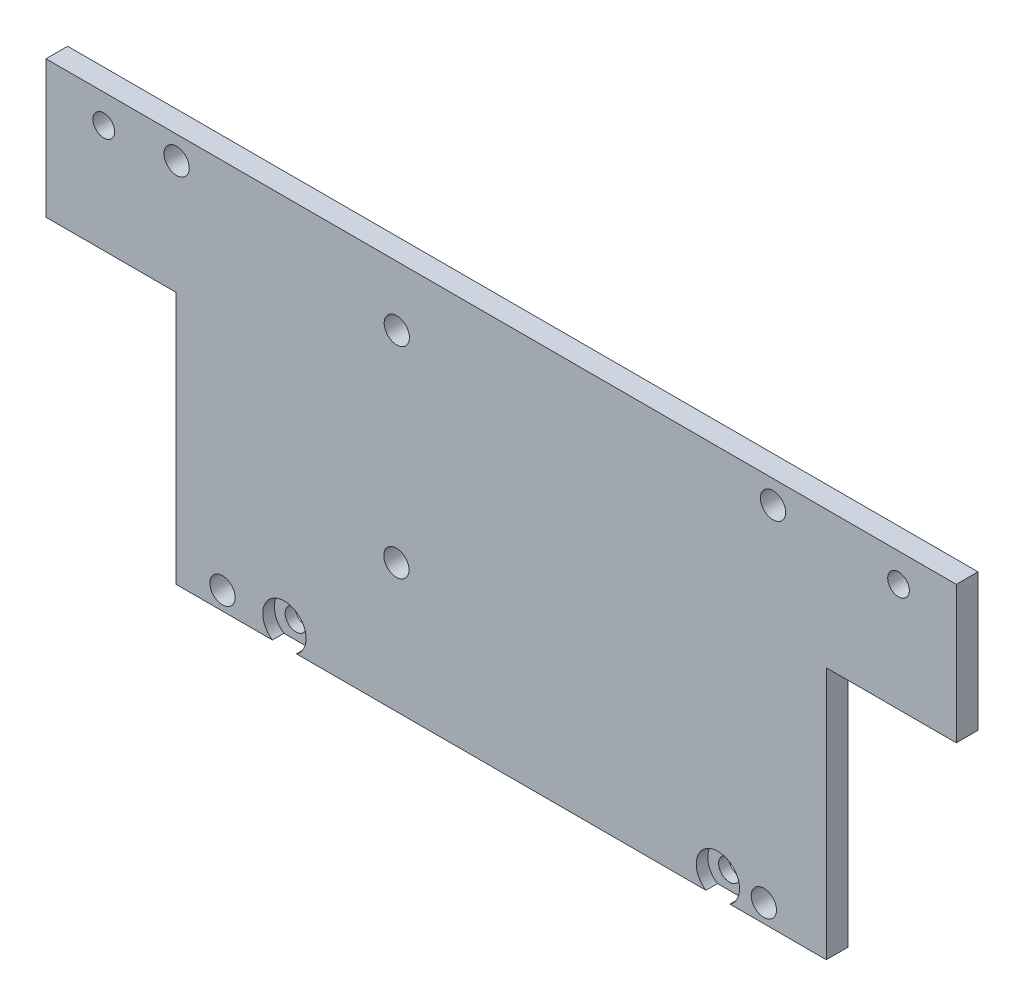
ISO-10303-21;
HEADER;
FILE_DESCRIPTION(('STEP AP214'),'2;1');
FILE_NAME('part.step','',(''),(''),'','','');
FILE_SCHEMA(('AUTOMOTIVE_DESIGN { 1 0 10303 214 1 1 1 1 }'));
ENDSEC;
DATA;
#1=APPLICATION_CONTEXT('core data for automotive mechanical design processes');
#2=APPLICATION_PROTOCOL_DEFINITION('international standard','automotive_design',2000,#1);
#3=PRODUCT_CONTEXT('',#1,'mechanical');
#4=PRODUCT('Part','Part','',(#3));
#5=PRODUCT_RELATED_PRODUCT_CATEGORY('part','',(#4));
#6=PRODUCT_DEFINITION_FORMATION('','',#4);
#7=PRODUCT_DEFINITION_CONTEXT('part definition',#1,'design');
#8=PRODUCT_DEFINITION('design','',#6,#7);
#9=PRODUCT_DEFINITION_SHAPE('','',#8);
#10=(LENGTH_UNIT() NAMED_UNIT(*) SI_UNIT(.MILLI.,.METRE.));
#11=(NAMED_UNIT(*) PLANE_ANGLE_UNIT() SI_UNIT($,.RADIAN.));
#12=(NAMED_UNIT(*) SI_UNIT($,.STERADIAN.) SOLID_ANGLE_UNIT());
#13=UNCERTAINTY_MEASURE_WITH_UNIT(LENGTH_MEASURE(1.E-05),#10,'distance_accuracy_value','');
#14=(GEOMETRIC_REPRESENTATION_CONTEXT(3) GLOBAL_UNCERTAINTY_ASSIGNED_CONTEXT((#13)) GLOBAL_UNIT_ASSIGNED_CONTEXT((#10,
#11,#12)) REPRESENTATION_CONTEXT('',''));
#15=CARTESIAN_POINT('',(0.,0.,0.));
#16=DIRECTION('',(0.,0.,1.));
#17=DIRECTION('',(1.,0.,0.));
#18=AXIS2_PLACEMENT_3D('',#15,#16,#17);
#19=CARTESIAN_POINT('',(45.,2.49999999999999,3.));
#20=DIRECTION('',(0.,0.,-1.));
#21=DIRECTION('',(-1.,0.,0.));
#22=AXIS2_PLACEMENT_3D('',#19,#20,#21);
#23=CYLINDRICAL_SURFACE('',#22,1.5);
#24=CARTESIAN_POINT('',(45.,2.49999999999999,0.));
#25=DIRECTION('',(0.,0.,-1.));
#26=DIRECTION('',(1.,0.,0.));
#27=AXIS2_PLACEMENT_3D('',#24,#25,#26);
#28=CIRCLE('',#27,1.5);
#29=CARTESIAN_POINT('',(46.5,2.49999999999999,0.));
#30=VERTEX_POINT('',#29);
#31=EDGE_CURVE('E217',#30,#30,#28,.T.);
#32=ORIENTED_EDGE('',*,*,#31,.T.);
#33=EDGE_LOOP('',(#32));
#34=FACE_BOUND('',#33,.T.);
#35=CARTESIAN_POINT('',(45.,2.49999999999999,1.4));
#36=DIRECTION('',(0.,0.,1.));
#37=DIRECTION('',(1.,0.,0.));
#38=AXIS2_PLACEMENT_3D('',#35,#36,#37);
#39=CIRCLE('',#38,1.5);
#40=CARTESIAN_POINT('',(46.5,2.49999999999999,1.4));
#41=VERTEX_POINT('',#40);
#42=EDGE_CURVE('E45',#41,#41,#39,.F.);
#43=ORIENTED_EDGE('',*,*,#42,.F.);
#44=EDGE_LOOP('',(#43));
#45=FACE_BOUND('',#44,.T.);
#46=ADVANCED_FACE('F41',(#34,#45),#23,.F.);
#47=CARTESIAN_POINT('',(105.,2.49999999999999,3.));
#48=DIRECTION('',(0.,0.,-1.));
#49=DIRECTION('',(-1.,0.,0.));
#50=AXIS2_PLACEMENT_3D('',#47,#48,#49);
#51=CYLINDRICAL_SURFACE('',#50,1.5);
#52=CARTESIAN_POINT('',(105.,2.49999999999999,0.));
#53=DIRECTION('',(0.,0.,-1.));
#54=DIRECTION('',(-1.,0.,0.));
#55=AXIS2_PLACEMENT_3D('',#52,#53,#54);
#56=CIRCLE('',#55,1.5);
#57=CARTESIAN_POINT('',(103.5,2.49999999999999,0.));
#58=VERTEX_POINT('',#57);
#59=EDGE_CURVE('E213',#58,#58,#56,.T.);
#60=ORIENTED_EDGE('',*,*,#59,.T.);
#61=EDGE_LOOP('',(#60));
#62=FACE_BOUND('',#61,.T.);
#63=CARTESIAN_POINT('',(105.,2.49999999999999,1.4));
#64=DIRECTION('',(0.,0.,1.));
#65=DIRECTION('',(1.,0.,0.));
#66=AXIS2_PLACEMENT_3D('',#63,#64,#65);
#67=CIRCLE('',#66,1.5);
#68=CARTESIAN_POINT('',(106.5,2.49999999999999,1.4));
#69=VERTEX_POINT('',#68);
#70=EDGE_CURVE('E172',#69,#69,#67,.F.);
#71=ORIENTED_EDGE('',*,*,#70,.F.);
#72=EDGE_LOOP('',(#71));
#73=FACE_BOUND('',#72,.T.);
#74=ADVANCED_FACE('F340',(#62,#73),#51,.F.);
#75=CARTESIAN_POINT('',(0.,0.,3.));
#76=DIRECTION('',(0.,1.,0.));
#77=DIRECTION('',(0.,0.,1.));
#78=AXIS2_PLACEMENT_3D('',#75,#76,#77);
#79=PLANE('',#78);
#80=DIRECTION('',(1.,0.,0.));
#81=VECTOR('',#80,1.);
#82=CARTESIAN_POINT('',(0.,0.,1.4));
#83=LINE('',#82,#81);
#84=CARTESIAN_POINT('',(43.3416876048223,0.,1.4));
#85=VERTEX_POINT('',#84);
#86=CARTESIAN_POINT('',(46.6583123951777,0.,1.4));
#87=VERTEX_POINT('',#86);
#88=EDGE_CURVE('E192',#85,#87,#83,.T.);
#89=ORIENTED_EDGE('',*,*,#88,.F.);
#90=DIRECTION('',(0.,0.,1.));
#91=VECTOR('',#90,1.);
#92=CARTESIAN_POINT('',(43.3416876048223,0.,1.4));
#93=LINE('',#92,#91);
#94=CARTESIAN_POINT('',(43.3416876048223,0.,3.));
#95=VERTEX_POINT('',#94);
#96=EDGE_CURVE('E199',#85,#95,#93,.T.);
#97=ORIENTED_EDGE('',*,*,#96,.T.);
#98=DIRECTION('',(1.,0.,0.));
#99=VECTOR('',#98,1.);
#100=CARTESIAN_POINT('',(0.,0.,3.));
#101=LINE('',#100,#99);
#102=CARTESIAN_POINT('',(30.,0.,3.));
#103=VERTEX_POINT('',#102);
#104=EDGE_CURVE('E51',#103,#95,#101,.T.);
#105=ORIENTED_EDGE('',*,*,#104,.F.);
#106=DIRECTION('',(0.,0.,-1.));
#107=VECTOR('',#106,1.);
#108=CARTESIAN_POINT('',(30.,0.,3.));
#109=LINE('',#108,#107);
#110=CARTESIAN_POINT('',(30.,0.,0.));
#111=VERTEX_POINT('',#110);
#112=EDGE_CURVE('E270',#103,#111,#109,.T.);
#113=ORIENTED_EDGE('',*,*,#112,.T.);
#114=DIRECTION('',(1.,0.,0.));
#115=VECTOR('',#114,1.);
#116=CARTESIAN_POINT('',(0.,0.,0.));
#117=LINE('',#116,#115);
#118=CARTESIAN_POINT('',(120.,0.,0.));
#119=VERTEX_POINT('',#118);
#120=EDGE_CURVE('E165',#111,#119,#117,.T.);
#121=ORIENTED_EDGE('',*,*,#120,.T.);
#122=DIRECTION('',(0.,0.,-1.));
#123=VECTOR('',#122,1.);
#124=CARTESIAN_POINT('',(120.,0.,3.));
#125=LINE('',#124,#123);
#126=CARTESIAN_POINT('',(120.,0.,3.));
#127=VERTEX_POINT('',#126);
#128=EDGE_CURVE('E265',#127,#119,#125,.T.);
#129=ORIENTED_EDGE('',*,*,#128,.F.);
#130=CARTESIAN_POINT('',(106.658312395178,0.,3.));
#131=VERTEX_POINT('',#130);
#132=EDGE_CURVE('E156',#131,#127,#101,.T.);
#133=ORIENTED_EDGE('',*,*,#132,.F.);
#134=DIRECTION('',(0.,0.,1.));
#135=VECTOR('',#134,1.);
#136=CARTESIAN_POINT('',(106.658312395178,0.,1.4));
#137=LINE('',#136,#135);
#138=CARTESIAN_POINT('',(106.658312395178,0.,1.4));
#139=VERTEX_POINT('',#138);
#140=EDGE_CURVE('E59',#131,#139,#137,.F.);
#141=ORIENTED_EDGE('',*,*,#140,.T.);
#142=DIRECTION('',(1.,0.,0.));
#143=VECTOR('',#142,1.);
#144=CARTESIAN_POINT('',(0.,0.,1.4));
#145=LINE('',#144,#143);
#146=CARTESIAN_POINT('',(103.341687604822,0.,1.4));
#147=VERTEX_POINT('',#146);
#148=EDGE_CURVE('E149',#147,#139,#145,.T.);
#149=ORIENTED_EDGE('',*,*,#148,.F.);
#150=DIRECTION('',(0.,0.,1.));
#151=VECTOR('',#150,1.);
#152=CARTESIAN_POINT('',(103.341687604822,0.,1.4));
#153=LINE('',#152,#151);
#154=CARTESIAN_POINT('',(103.341687604822,0.,3.));
#155=VERTEX_POINT('',#154);
#156=EDGE_CURVE('E135',#147,#155,#153,.T.);
#157=ORIENTED_EDGE('',*,*,#156,.T.);
#158=CARTESIAN_POINT('',(46.6583123951777,0.,3.));
#159=VERTEX_POINT('',#158);
#160=EDGE_CURVE('E148',#159,#155,#101,.T.);
#161=ORIENTED_EDGE('',*,*,#160,.F.);
#162=DIRECTION('',(0.,0.,1.));
#163=VECTOR('',#162,1.);
#164=CARTESIAN_POINT('',(46.6583123951777,0.,1.4));
#165=LINE('',#164,#163);
#166=EDGE_CURVE('E67',#159,#87,#165,.F.);
#167=ORIENTED_EDGE('',*,*,#166,.T.);
#168=EDGE_LOOP('',(#89,#97,#105,#113,#121,#129,#133,#141,#149,#157,#161,#167));
#169=FACE_BOUND('',#168,.T.);
#170=ADVANCED_FACE('F43',(#169),#79,.F.);
#171=CARTESIAN_POINT('',(0.,54.,3.));
#172=DIRECTION('',(0.,-1.,0.));
#173=DIRECTION('',(0.,0.,-1.));
#174=AXIS2_PLACEMENT_3D('',#171,#172,#173);
#175=PLANE('',#174);
#176=DIRECTION('',(-1.,0.,0.));
#177=VECTOR('',#176,1.);
#178=CARTESIAN_POINT('',(0.,54.,3.));
#179=LINE('',#178,#177);
#180=CARTESIAN_POINT('',(138.,54.,3.));
#181=VERTEX_POINT('',#180);
#182=CARTESIAN_POINT('',(12.,54.,3.));
#183=VERTEX_POINT('',#182);
#184=EDGE_CURVE('E11',#181,#183,#179,.T.);
#185=ORIENTED_EDGE('',*,*,#184,.F.);
#186=DIRECTION('',(0.,0.,-1.));
#187=VECTOR('',#186,1.);
#188=CARTESIAN_POINT('',(138.,54.,3.));
#189=LINE('',#188,#187);
#190=CARTESIAN_POINT('',(138.,54.,0.));
#191=VERTEX_POINT('',#190);
#192=EDGE_CURVE('E237',#181,#191,#189,.T.);
#193=ORIENTED_EDGE('',*,*,#192,.T.);
#194=DIRECTION('',(-1.,0.,0.));
#195=VECTOR('',#194,1.);
#196=CARTESIAN_POINT('',(0.,54.,0.));
#197=LINE('',#196,#195);
#198=CARTESIAN_POINT('',(12.,54.,0.));
#199=VERTEX_POINT('',#198);
#200=EDGE_CURVE('E160',#191,#199,#197,.T.);
#201=ORIENTED_EDGE('',*,*,#200,.T.);
#202=DIRECTION('',(0.,0.,-1.));
#203=VECTOR('',#202,1.);
#204=CARTESIAN_POINT('',(12.,54.,3.));
#205=LINE('',#204,#203);
#206=EDGE_CURVE('E248',#183,#199,#205,.T.);
#207=ORIENTED_EDGE('',*,*,#206,.F.);
#208=EDGE_LOOP('',(#185,#193,#201,#207));
#209=FACE_BOUND('',#208,.T.);
#210=ADVANCED_FACE('F323',(#209),#175,.F.);
#211=CARTESIAN_POINT('',(0.,0.,3.));
#212=DIRECTION('',(0.,0.,-1.));
#213=DIRECTION('',(-1.,0.,0.));
#214=AXIS2_PLACEMENT_3D('',#211,#212,#213);
#215=PLANE('',#214);
#216=CARTESIAN_POINT('',(30.08,50.8,3.));
#217=DIRECTION('',(0.,0.,1.));
#218=DIRECTION('',(1.,0.,0.));
#219=AXIS2_PLACEMENT_3D('',#216,#217,#218);
#220=CIRCLE('',#219,1.75);
#221=CARTESIAN_POINT('',(31.83,50.8,3.));
#222=VERTEX_POINT('',#221);
#223=EDGE_CURVE('E395',#222,#222,#220,.T.);
#224=ORIENTED_EDGE('',*,*,#223,.F.);
#225=EDGE_LOOP('',(#224));
#226=FACE_BOUND('',#225,.T.);
#227=CARTESIAN_POINT('',(60.56,45.72,3.));
#228=DIRECTION('',(0.,0.,1.));
#229=DIRECTION('',(1.,0.,0.));
#230=AXIS2_PLACEMENT_3D('',#227,#228,#229);
#231=CIRCLE('',#230,1.75);
#232=CARTESIAN_POINT('',(62.31,45.72,3.));
#233=VERTEX_POINT('',#232);
#234=EDGE_CURVE('E404',#233,#233,#231,.T.);
#235=ORIENTED_EDGE('',*,*,#234,.F.);
#236=EDGE_LOOP('',(#235));
#237=FACE_BOUND('',#236,.T.);
#238=CARTESIAN_POINT('',(60.5,17.84,3.));
#239=DIRECTION('',(0.,0.,1.));
#240=DIRECTION('',(1.,0.,0.));
#241=AXIS2_PLACEMENT_3D('',#238,#239,#240);
#242=CIRCLE('',#241,1.75);
#243=CARTESIAN_POINT('',(62.25,17.84,3.));
#244=VERTEX_POINT('',#243);
#245=EDGE_CURVE('E414',#244,#244,#242,.T.);
#246=ORIENTED_EDGE('',*,*,#245,.F.);
#247=EDGE_LOOP('',(#246));
#248=FACE_BOUND('',#247,.T.);
#249=CARTESIAN_POINT('',(36.43,2.5,3.));
#250=DIRECTION('',(0.,0.,1.));
#251=DIRECTION('',(1.,0.,0.));
#252=AXIS2_PLACEMENT_3D('',#249,#250,#251);
#253=CIRCLE('',#252,1.75);
#254=CARTESIAN_POINT('',(38.18,2.5,3.));
#255=VERTEX_POINT('',#254);
#256=EDGE_CURVE('E422',#255,#255,#253,.T.);
#257=ORIENTED_EDGE('',*,*,#256,.F.);
#258=EDGE_LOOP('',(#257));
#259=FACE_BOUND('',#258,.T.);
#260=CARTESIAN_POINT('',(111.36,2.5,3.));
#261=DIRECTION('',(0.,0.,1.));
#262=DIRECTION('',(1.,0.,0.));
#263=AXIS2_PLACEMENT_3D('',#260,#261,#262);
#264=CIRCLE('',#263,1.75);
#265=CARTESIAN_POINT('',(113.11,2.5,3.));
#266=VERTEX_POINT('',#265);
#267=EDGE_CURVE('E430',#266,#266,#264,.T.);
#268=ORIENTED_EDGE('',*,*,#267,.F.);
#269=EDGE_LOOP('',(#268));
#270=FACE_BOUND('',#269,.T.);
#271=CARTESIAN_POINT('',(112.63,50.8,3.));
#272=DIRECTION('',(0.,0.,1.));
#273=DIRECTION('',(1.,0.,0.));
#274=AXIS2_PLACEMENT_3D('',#271,#272,#273);
#275=CIRCLE('',#274,1.75);
#276=CARTESIAN_POINT('',(114.38,50.8,3.));
#277=VERTEX_POINT('',#276);
#278=EDGE_CURVE('E187',#277,#277,#275,.T.);
#279=ORIENTED_EDGE('',*,*,#278,.F.);
#280=EDGE_LOOP('',(#279));
#281=FACE_BOUND('',#280,.T.);
#282=CARTESIAN_POINT('',(130.,50.,3.));
#283=DIRECTION('',(0.,0.,-1.));
#284=DIRECTION('',(-1.,0.,0.));
#285=AXIS2_PLACEMENT_3D('',#282,#283,#284);
#286=CIRCLE('',#285,1.5);
#287=CARTESIAN_POINT('',(128.5,50.,3.));
#288=VERTEX_POINT('',#287);
#289=EDGE_CURVE('E204',#288,#288,#286,.T.);
#290=ORIENTED_EDGE('',*,*,#289,.T.);
#291=EDGE_LOOP('',(#290));
#292=FACE_BOUND('',#291,.T.);
#293=CARTESIAN_POINT('',(20.,50.,3.));
#294=DIRECTION('',(0.,0.,-1.));
#295=DIRECTION('',(1.,0.,0.));
#296=AXIS2_PLACEMENT_3D('',#293,#294,#295);
#297=CIRCLE('',#296,1.49999999999999);
#298=CARTESIAN_POINT('',(21.5,50.,3.));
#299=VERTEX_POINT('',#298);
#300=EDGE_CURVE('E221',#299,#299,#297,.T.);
#301=ORIENTED_EDGE('',*,*,#300,.T.);
#302=EDGE_LOOP('',(#301));
#303=FACE_BOUND('',#302,.T.);
#304=ORIENTED_EDGE('',*,*,#104,.T.);
#305=CARTESIAN_POINT('',(45.,2.49999999999999,3.));
#306=DIRECTION('',(0.,0.,1.));
#307=DIRECTION('',(1.,0.,0.));
#308=AXIS2_PLACEMENT_3D('',#305,#306,#307);
#309=CIRCLE('',#308,3.00000000000001);
#310=EDGE_CURVE('E154',#159,#95,#309,.T.);
#311=ORIENTED_EDGE('',*,*,#310,.F.);
#312=ORIENTED_EDGE('',*,*,#160,.T.);
#313=CARTESIAN_POINT('',(105.,2.49999999999999,3.));
#314=DIRECTION('',(0.,0.,1.));
#315=DIRECTION('',(1.,0.,0.));
#316=AXIS2_PLACEMENT_3D('',#313,#314,#315);
#317=CIRCLE('',#316,3.00000000000001);
#318=EDGE_CURVE('E132',#131,#155,#317,.T.);
#319=ORIENTED_EDGE('',*,*,#318,.F.);
#320=ORIENTED_EDGE('',*,*,#132,.T.);
#321=DIRECTION('',(0.,1.,0.));
#322=VECTOR('',#321,1.);
#323=CARTESIAN_POINT('',(120.,0.,3.));
#324=LINE('',#323,#322);
#325=CARTESIAN_POINT('',(120.,35.,3.));
#326=VERTEX_POINT('',#325);
#327=EDGE_CURVE('E256',#127,#326,#324,.T.);
#328=ORIENTED_EDGE('',*,*,#327,.T.);
#329=DIRECTION('',(1.,0.,0.));
#330=VECTOR('',#329,1.);
#331=CARTESIAN_POINT('',(150.,35.,3.));
#332=LINE('',#331,#330);
#333=CARTESIAN_POINT('',(138.,35.,3.));
#334=VERTEX_POINT('',#333);
#335=EDGE_CURVE('E260',#326,#334,#332,.T.);
#336=ORIENTED_EDGE('',*,*,#335,.T.);
#337=DIRECTION('',(0.,1.,0.));
#338=VECTOR('',#337,1.);
#339=CARTESIAN_POINT('',(138.,54.,3.));
#340=LINE('',#339,#338);
#341=EDGE_CURVE('E228',#334,#181,#340,.T.);
#342=ORIENTED_EDGE('',*,*,#341,.T.);
#343=ORIENTED_EDGE('',*,*,#184,.T.);
#344=DIRECTION('',(0.,-1.,0.));
#345=VECTOR('',#344,1.);
#346=CARTESIAN_POINT('',(12.,54.,3.));
#347=LINE('',#346,#345);
#348=CARTESIAN_POINT('',(12.,35.,3.));
#349=VERTEX_POINT('',#348);
#350=EDGE_CURVE('E244',#183,#349,#347,.T.);
#351=ORIENTED_EDGE('',*,*,#350,.T.);
#352=DIRECTION('',(1.,0.,0.));
#353=VECTOR('',#352,1.);
#354=CARTESIAN_POINT('',(0.,35.0000000000001,3.));
#355=LINE('',#354,#353);
#356=CARTESIAN_POINT('',(30.,35.,3.));
#357=VERTEX_POINT('',#356);
#358=EDGE_CURVE('E278',#349,#357,#355,.T.);
#359=ORIENTED_EDGE('',*,*,#358,.T.);
#360=DIRECTION('',(0.,-1.,0.));
#361=VECTOR('',#360,1.);
#362=CARTESIAN_POINT('',(30.,0.,3.));
#363=LINE('',#362,#361);
#364=EDGE_CURVE('E281',#357,#103,#363,.T.);
#365=ORIENTED_EDGE('',*,*,#364,.T.);
#366=EDGE_LOOP('',(#304,#311,#312,#319,#320,#328,#336,#342,#343,#351,#359,#365));
#367=FACE_BOUND('',#366,.T.);
#368=ADVANCED_FACE('F153',(#226,#237,#248,#259,#270,#281,#292,#303,#367),#215,.F.);
#369=CARTESIAN_POINT('',(0.,0.,0.));
#370=DIRECTION('',(0.,0.,-1.));
#371=DIRECTION('',(-1.,0.,0.));
#372=AXIS2_PLACEMENT_3D('',#369,#370,#371);
#373=PLANE('',#372);
#374=CARTESIAN_POINT('',(30.08,50.8,0.));
#375=DIRECTION('',(0.,0.,1.));
#376=DIRECTION('',(1.,0.,0.));
#377=AXIS2_PLACEMENT_3D('',#374,#375,#376);
#378=CIRCLE('',#377,1.75);
#379=CARTESIAN_POINT('',(31.83,50.8,0.));
#380=VERTEX_POINT('',#379);
#381=EDGE_CURVE('E142',#380,#380,#378,.T.);
#382=ORIENTED_EDGE('',*,*,#381,.T.);
#383=EDGE_LOOP('',(#382));
#384=FACE_BOUND('',#383,.T.);
#385=CARTESIAN_POINT('',(60.56,45.72,0.));
#386=DIRECTION('',(0.,0.,1.));
#387=DIRECTION('',(1.,0.,0.));
#388=AXIS2_PLACEMENT_3D('',#385,#386,#387);
#389=CIRCLE('',#388,1.75);
#390=CARTESIAN_POINT('',(62.31,45.72,0.));
#391=VERTEX_POINT('',#390);
#392=EDGE_CURVE('E398',#391,#391,#389,.T.);
#393=ORIENTED_EDGE('',*,*,#392,.T.);
#394=EDGE_LOOP('',(#393));
#395=FACE_BOUND('',#394,.T.);
#396=CARTESIAN_POINT('',(60.5,17.84,0.));
#397=DIRECTION('',(0.,0.,1.));
#398=DIRECTION('',(1.,0.,0.));
#399=AXIS2_PLACEMENT_3D('',#396,#397,#398);
#400=CIRCLE('',#399,1.75);
#401=CARTESIAN_POINT('',(62.25,17.84,0.));
#402=VERTEX_POINT('',#401);
#403=EDGE_CURVE('E410',#402,#402,#400,.T.);
#404=ORIENTED_EDGE('',*,*,#403,.T.);
#405=EDGE_LOOP('',(#404));
#406=FACE_BOUND('',#405,.T.);
#407=CARTESIAN_POINT('',(36.43,2.5,0.));
#408=DIRECTION('',(0.,0.,1.));
#409=DIRECTION('',(1.,0.,0.));
#410=AXIS2_PLACEMENT_3D('',#407,#408,#409);
#411=CIRCLE('',#410,1.75);
#412=CARTESIAN_POINT('',(38.18,2.5,0.));
#413=VERTEX_POINT('',#412);
#414=EDGE_CURVE('E418',#413,#413,#411,.T.);
#415=ORIENTED_EDGE('',*,*,#414,.T.);
#416=EDGE_LOOP('',(#415));
#417=FACE_BOUND('',#416,.T.);
#418=CARTESIAN_POINT('',(111.36,2.5,0.));
#419=DIRECTION('',(0.,0.,1.));
#420=DIRECTION('',(1.,0.,0.));
#421=AXIS2_PLACEMENT_3D('',#418,#419,#420);
#422=CIRCLE('',#421,1.75);
#423=CARTESIAN_POINT('',(113.11,2.5,0.));
#424=VERTEX_POINT('',#423);
#425=EDGE_CURVE('E426',#424,#424,#422,.T.);
#426=ORIENTED_EDGE('',*,*,#425,.T.);
#427=EDGE_LOOP('',(#426));
#428=FACE_BOUND('',#427,.T.);
#429=CARTESIAN_POINT('',(112.63,50.8,0.));
#430=DIRECTION('',(0.,0.,1.));
#431=DIRECTION('',(1.,0.,0.));
#432=AXIS2_PLACEMENT_3D('',#429,#430,#431);
#433=CIRCLE('',#432,1.75);
#434=CARTESIAN_POINT('',(114.38,50.8,0.));
#435=VERTEX_POINT('',#434);
#436=EDGE_CURVE('E433',#435,#435,#433,.T.);
#437=ORIENTED_EDGE('',*,*,#436,.T.);
#438=EDGE_LOOP('',(#437));
#439=FACE_BOUND('',#438,.T.);
#440=CARTESIAN_POINT('',(130.,50.,0.));
#441=DIRECTION('',(0.,0.,-1.));
#442=DIRECTION('',(-1.,0.,0.));
#443=AXIS2_PLACEMENT_3D('',#440,#441,#442);
#444=CIRCLE('',#443,1.5);
#445=CARTESIAN_POINT('',(128.5,50.,0.));
#446=VERTEX_POINT('',#445);
#447=EDGE_CURVE('E209',#446,#446,#444,.T.);
#448=ORIENTED_EDGE('',*,*,#447,.F.);
#449=EDGE_LOOP('',(#448));
#450=FACE_BOUND('',#449,.T.);
#451=ORIENTED_EDGE('',*,*,#59,.F.);
#452=EDGE_LOOP('',(#451));
#453=FACE_BOUND('',#452,.T.);
#454=ORIENTED_EDGE('',*,*,#31,.F.);
#455=EDGE_LOOP('',(#454));
#456=FACE_BOUND('',#455,.T.);
#457=CARTESIAN_POINT('',(20.,50.,0.));
#458=DIRECTION('',(0.,0.,-1.));
#459=DIRECTION('',(1.,0.,0.));
#460=AXIS2_PLACEMENT_3D('',#457,#458,#459);
#461=CIRCLE('',#460,1.49999999999999);
#462=CARTESIAN_POINT('',(21.5,50.,0.));
#463=VERTEX_POINT('',#462);
#464=EDGE_CURVE('E203',#463,#463,#461,.T.);
#465=ORIENTED_EDGE('',*,*,#464,.F.);
#466=EDGE_LOOP('',(#465));
#467=FACE_BOUND('',#466,.T.);
#468=DIRECTION('',(0.,1.,0.));
#469=VECTOR('',#468,1.);
#470=CARTESIAN_POINT('',(138.,54.,0.));
#471=LINE('',#470,#469);
#472=CARTESIAN_POINT('',(138.,35.,0.));
#473=VERTEX_POINT('',#472);
#474=EDGE_CURVE('E233',#473,#191,#471,.T.);
#475=ORIENTED_EDGE('',*,*,#474,.F.);
#476=DIRECTION('',(1.,0.,0.));
#477=VECTOR('',#476,1.);
#478=CARTESIAN_POINT('',(150.,35.,0.));
#479=LINE('',#478,#477);
#480=CARTESIAN_POINT('',(120.,35.,0.));
#481=VERTEX_POINT('',#480);
#482=EDGE_CURVE('E261',#481,#473,#479,.T.);
#483=ORIENTED_EDGE('',*,*,#482,.F.);
#484=DIRECTION('',(0.,1.,0.));
#485=VECTOR('',#484,1.);
#486=CARTESIAN_POINT('',(120.,0.,0.));
#487=LINE('',#486,#485);
#488=EDGE_CURVE('E266',#119,#481,#487,.T.);
#489=ORIENTED_EDGE('',*,*,#488,.F.);
#490=ORIENTED_EDGE('',*,*,#120,.F.);
#491=DIRECTION('',(0.,-1.,0.));
#492=VECTOR('',#491,1.);
#493=CARTESIAN_POINT('',(30.,0.,0.));
#494=LINE('',#493,#492);
#495=CARTESIAN_POINT('',(30.,35.,0.));
#496=VERTEX_POINT('',#495);
#497=EDGE_CURVE('E282',#496,#111,#494,.T.);
#498=ORIENTED_EDGE('',*,*,#497,.F.);
#499=DIRECTION('',(1.,0.,0.));
#500=VECTOR('',#499,1.);
#501=CARTESIAN_POINT('',(0.,35.0000000000001,0.));
#502=LINE('',#501,#500);
#503=CARTESIAN_POINT('',(12.,35.,0.));
#504=VERTEX_POINT('',#503);
#505=EDGE_CURVE('E241',#504,#496,#502,.T.);
#506=ORIENTED_EDGE('',*,*,#505,.F.);
#507=DIRECTION('',(0.,-1.,0.));
#508=VECTOR('',#507,1.);
#509=CARTESIAN_POINT('',(12.,54.,0.));
#510=LINE('',#509,#508);
#511=EDGE_CURVE('E208',#199,#504,#510,.T.);
#512=ORIENTED_EDGE('',*,*,#511,.F.);
#513=ORIENTED_EDGE('',*,*,#200,.F.);
#514=EDGE_LOOP('',(#475,#483,#489,#490,#498,#506,#512,#513));
#515=FACE_BOUND('',#514,.T.);
#516=ADVANCED_FACE('F305',(#384,#395,#406,#417,#428,#439,#450,#453,#456,#467,#515),#373,.T.);
#517=CARTESIAN_POINT('',(30.,0.,3.));
#518=DIRECTION('',(1.,0.,0.));
#519=DIRECTION('',(0.,0.,-1.));
#520=AXIS2_PLACEMENT_3D('',#517,#518,#519);
#521=PLANE('',#520);
#522=ORIENTED_EDGE('',*,*,#497,.T.);
#523=ORIENTED_EDGE('',*,*,#112,.F.);
#524=ORIENTED_EDGE('',*,*,#364,.F.);
#525=DIRECTION('',(0.,0.,-1.));
#526=VECTOR('',#525,1.);
#527=CARTESIAN_POINT('',(30.,35.,3.));
#528=LINE('',#527,#526);
#529=EDGE_CURVE('E162',#357,#496,#528,.T.);
#530=ORIENTED_EDGE('',*,*,#529,.T.);
#531=EDGE_LOOP('',(#522,#523,#524,#530));
#532=FACE_BOUND('',#531,.T.);
#533=ADVANCED_FACE('F299',(#532),#521,.F.);
#534=CARTESIAN_POINT('',(0.,35.0000000000001,3.));
#535=DIRECTION('',(0.,1.,0.));
#536=DIRECTION('',(-1.,0.,0.));
#537=AXIS2_PLACEMENT_3D('',#534,#535,#536);
#538=PLANE('',#537);
#539=ORIENTED_EDGE('',*,*,#358,.F.);
#540=DIRECTION('',(0.,0.,-1.));
#541=VECTOR('',#540,1.);
#542=CARTESIAN_POINT('',(12.,35.,3.));
#543=LINE('',#542,#541);
#544=EDGE_CURVE('E236',#349,#504,#543,.T.);
#545=ORIENTED_EDGE('',*,*,#544,.T.);
#546=ORIENTED_EDGE('',*,*,#505,.T.);
#547=ORIENTED_EDGE('',*,*,#529,.F.);
#548=EDGE_LOOP('',(#539,#545,#546,#547));
#549=FACE_BOUND('',#548,.T.);
#550=ADVANCED_FACE('F325',(#549),#538,.F.);
#551=CARTESIAN_POINT('',(150.,35.,3.));
#552=DIRECTION('',(0.,1.,0.));
#553=DIRECTION('',(0.,0.,1.));
#554=AXIS2_PLACEMENT_3D('',#551,#552,#553);
#555=PLANE('',#554);
#556=ORIENTED_EDGE('',*,*,#482,.T.);
#557=DIRECTION('',(0.,0.,-1.));
#558=VECTOR('',#557,1.);
#559=CARTESIAN_POINT('',(138.,35.,3.));
#560=LINE('',#559,#558);
#561=EDGE_CURVE('E232',#334,#473,#560,.T.);
#562=ORIENTED_EDGE('',*,*,#561,.F.);
#563=ORIENTED_EDGE('',*,*,#335,.F.);
#564=DIRECTION('',(0.,0.,-1.));
#565=VECTOR('',#564,1.);
#566=CARTESIAN_POINT('',(120.,35.,3.));
#567=LINE('',#566,#565);
#568=EDGE_CURVE('E169',#326,#481,#567,.T.);
#569=ORIENTED_EDGE('',*,*,#568,.T.);
#570=EDGE_LOOP('',(#556,#562,#563,#569));
#571=FACE_BOUND('',#570,.T.);
#572=ADVANCED_FACE('F317',(#571),#555,.F.);
#573=CARTESIAN_POINT('',(120.,0.,3.));
#574=DIRECTION('',(-1.,0.,0.));
#575=DIRECTION('',(0.,0.,1.));
#576=AXIS2_PLACEMENT_3D('',#573,#574,#575);
#577=PLANE('',#576);
#578=ORIENTED_EDGE('',*,*,#488,.T.);
#579=ORIENTED_EDGE('',*,*,#568,.F.);
#580=ORIENTED_EDGE('',*,*,#327,.F.);
#581=ORIENTED_EDGE('',*,*,#128,.T.);
#582=EDGE_LOOP('',(#578,#579,#580,#581));
#583=FACE_BOUND('',#582,.T.);
#584=ADVANCED_FACE('F312',(#583),#577,.F.);
#585=CARTESIAN_POINT('',(138.,54.,3.));
#586=DIRECTION('',(-1.,0.,0.));
#587=DIRECTION('',(0.,0.,1.));
#588=AXIS2_PLACEMENT_3D('',#585,#586,#587);
#589=PLANE('',#588);
#590=ORIENTED_EDGE('',*,*,#474,.T.);
#591=ORIENTED_EDGE('',*,*,#192,.F.);
#592=ORIENTED_EDGE('',*,*,#341,.F.);
#593=ORIENTED_EDGE('',*,*,#561,.T.);
#594=EDGE_LOOP('',(#590,#591,#592,#593));
#595=FACE_BOUND('',#594,.T.);
#596=ADVANCED_FACE('F319',(#595),#589,.F.);
#597=CARTESIAN_POINT('',(12.,54.,3.));
#598=DIRECTION('',(1.,0.,0.));
#599=DIRECTION('',(0.,0.,-1.));
#600=AXIS2_PLACEMENT_3D('',#597,#598,#599);
#601=PLANE('',#600);
#602=ORIENTED_EDGE('',*,*,#511,.T.);
#603=ORIENTED_EDGE('',*,*,#544,.F.);
#604=ORIENTED_EDGE('',*,*,#350,.F.);
#605=ORIENTED_EDGE('',*,*,#206,.T.);
#606=EDGE_LOOP('',(#602,#603,#604,#605));
#607=FACE_BOUND('',#606,.T.);
#608=ADVANCED_FACE('F326',(#607),#601,.F.);
#609=CARTESIAN_POINT('',(20.,50.,3.));
#610=DIRECTION('',(0.,0.,-1.));
#611=DIRECTION('',(-1.,0.,0.));
#612=AXIS2_PLACEMENT_3D('',#609,#610,#611);
#613=CYLINDRICAL_SURFACE('',#612,1.49999999999999);
#614=ORIENTED_EDGE('',*,*,#300,.F.);
#615=EDGE_LOOP('',(#614));
#616=FACE_BOUND('',#615,.T.);
#617=ORIENTED_EDGE('',*,*,#464,.T.);
#618=EDGE_LOOP('',(#617));
#619=FACE_BOUND('',#618,.T.);
#620=ADVANCED_FACE('F328',(#616,#619),#613,.F.);
#621=CARTESIAN_POINT('',(130.,50.,3.));
#622=DIRECTION('',(0.,0.,-1.));
#623=DIRECTION('',(-1.,0.,0.));
#624=AXIS2_PLACEMENT_3D('',#621,#622,#623);
#625=CYLINDRICAL_SURFACE('',#624,1.5);
#626=ORIENTED_EDGE('',*,*,#289,.F.);
#627=EDGE_LOOP('',(#626));
#628=FACE_BOUND('',#627,.T.);
#629=ORIENTED_EDGE('',*,*,#447,.T.);
#630=EDGE_LOOP('',(#629));
#631=FACE_BOUND('',#630,.T.);
#632=ADVANCED_FACE('F334',(#628,#631),#625,.F.);
#633=CARTESIAN_POINT('',(105.,2.49999999999999,1.4));
#634=DIRECTION('',(0.,0.,1.));
#635=DIRECTION('',(1.,0.,0.));
#636=AXIS2_PLACEMENT_3D('',#633,#634,#635);
#637=CYLINDRICAL_SURFACE('',#636,3.00000000000001);
#638=CARTESIAN_POINT('',(105.,2.49999999999999,1.4));
#639=DIRECTION('',(0.,0.,1.));
#640=DIRECTION('',(1.,0.,0.));
#641=AXIS2_PLACEMENT_3D('',#638,#639,#640);
#642=CIRCLE('',#641,3.00000000000001);
#643=EDGE_CURVE('E141',#139,#147,#642,.T.);
#644=ORIENTED_EDGE('',*,*,#643,.F.);
#645=ORIENTED_EDGE('',*,*,#140,.F.);
#646=ORIENTED_EDGE('',*,*,#318,.T.);
#647=ORIENTED_EDGE('',*,*,#156,.F.);
#648=EDGE_LOOP('',(#644,#645,#646,#647));
#649=FACE_BOUND('',#648,.T.);
#650=ADVANCED_FACE('F134',(#649),#637,.F.);
#651=CARTESIAN_POINT('',(105.,2.49999999999999,1.4));
#652=DIRECTION('',(0.,0.,1.));
#653=DIRECTION('',(1.,0.,0.));
#654=AXIS2_PLACEMENT_3D('',#651,#652,#653);
#655=PLANE('',#654);
#656=ORIENTED_EDGE('',*,*,#70,.T.);
#657=EDGE_LOOP('',(#656));
#658=FACE_BOUND('',#657,.T.);
#659=ORIENTED_EDGE('',*,*,#148,.T.);
#660=ORIENTED_EDGE('',*,*,#643,.T.);
#661=EDGE_LOOP('',(#659,#660));
#662=FACE_BOUND('',#661,.T.);
#663=ADVANCED_FACE('F355',(#658,#662),#655,.T.);
#664=CARTESIAN_POINT('',(45.,2.49999999999999,1.4));
#665=DIRECTION('',(0.,0.,1.));
#666=DIRECTION('',(1.,0.,0.));
#667=AXIS2_PLACEMENT_3D('',#664,#665,#666);
#668=CYLINDRICAL_SURFACE('',#667,3.00000000000001);
#669=CARTESIAN_POINT('',(45.,2.49999999999999,1.4));
#670=DIRECTION('',(0.,0.,1.));
#671=DIRECTION('',(1.,0.,0.));
#672=AXIS2_PLACEMENT_3D('',#669,#670,#671);
#673=CIRCLE('',#672,3.00000000000001);
#674=EDGE_CURVE('E175',#87,#85,#673,.T.);
#675=ORIENTED_EDGE('',*,*,#674,.F.);
#676=ORIENTED_EDGE('',*,*,#166,.F.);
#677=ORIENTED_EDGE('',*,*,#310,.T.);
#678=ORIENTED_EDGE('',*,*,#96,.F.);
#679=EDGE_LOOP('',(#675,#676,#677,#678));
#680=FACE_BOUND('',#679,.T.);
#681=ADVANCED_FACE('F358',(#680),#668,.F.);
#682=CARTESIAN_POINT('',(45.,2.49999999999999,1.4));
#683=DIRECTION('',(0.,0.,1.));
#684=DIRECTION('',(1.,0.,0.));
#685=AXIS2_PLACEMENT_3D('',#682,#683,#684);
#686=PLANE('',#685);
#687=ORIENTED_EDGE('',*,*,#42,.T.);
#688=EDGE_LOOP('',(#687));
#689=FACE_BOUND('',#688,.T.);
#690=ORIENTED_EDGE('',*,*,#88,.T.);
#691=ORIENTED_EDGE('',*,*,#674,.T.);
#692=EDGE_LOOP('',(#690,#691));
#693=FACE_BOUND('',#692,.T.);
#694=ADVANCED_FACE('F361',(#689,#693),#686,.T.);
#695=CARTESIAN_POINT('',(112.63,50.8,0.));
#696=DIRECTION('',(0.,0.,1.));
#697=DIRECTION('',(1.,0.,0.));
#698=AXIS2_PLACEMENT_3D('',#695,#696,#697);
#699=CYLINDRICAL_SURFACE('',#698,1.75);
#700=ORIENTED_EDGE('',*,*,#436,.F.);
#701=EDGE_LOOP('',(#700));
#702=FACE_BOUND('',#701,.T.);
#703=ORIENTED_EDGE('',*,*,#278,.T.);
#704=EDGE_LOOP('',(#703));
#705=FACE_BOUND('',#704,.T.);
#706=ADVANCED_FACE('F364',(#702,#705),#699,.F.);
#707=CARTESIAN_POINT('',(111.36,2.5,0.));
#708=DIRECTION('',(0.,0.,1.));
#709=DIRECTION('',(1.,0.,0.));
#710=AXIS2_PLACEMENT_3D('',#707,#708,#709);
#711=CYLINDRICAL_SURFACE('',#710,1.75);
#712=ORIENTED_EDGE('',*,*,#425,.F.);
#713=EDGE_LOOP('',(#712));
#714=FACE_BOUND('',#713,.T.);
#715=ORIENTED_EDGE('',*,*,#267,.T.);
#716=EDGE_LOOP('',(#715));
#717=FACE_BOUND('',#716,.T.);
#718=ADVANCED_FACE('F368',(#714,#717),#711,.F.);
#719=CARTESIAN_POINT('',(36.43,2.5,0.));
#720=DIRECTION('',(0.,0.,1.));
#721=DIRECTION('',(1.,0.,0.));
#722=AXIS2_PLACEMENT_3D('',#719,#720,#721);
#723=CYLINDRICAL_SURFACE('',#722,1.75);
#724=ORIENTED_EDGE('',*,*,#414,.F.);
#725=EDGE_LOOP('',(#724));
#726=FACE_BOUND('',#725,.T.);
#727=ORIENTED_EDGE('',*,*,#256,.T.);
#728=EDGE_LOOP('',(#727));
#729=FACE_BOUND('',#728,.T.);
#730=ADVANCED_FACE('F372',(#726,#729),#723,.F.);
#731=CARTESIAN_POINT('',(60.5,17.84,0.));
#732=DIRECTION('',(0.,0.,1.));
#733=DIRECTION('',(1.,0.,0.));
#734=AXIS2_PLACEMENT_3D('',#731,#732,#733);
#735=CYLINDRICAL_SURFACE('',#734,1.75);
#736=ORIENTED_EDGE('',*,*,#403,.F.);
#737=EDGE_LOOP('',(#736));
#738=FACE_BOUND('',#737,.T.);
#739=ORIENTED_EDGE('',*,*,#245,.T.);
#740=EDGE_LOOP('',(#739));
#741=FACE_BOUND('',#740,.T.);
#742=ADVANCED_FACE('F376',(#738,#741),#735,.F.);
#743=CARTESIAN_POINT('',(60.56,45.72,0.));
#744=DIRECTION('',(0.,0.,1.));
#745=DIRECTION('',(1.,0.,0.));
#746=AXIS2_PLACEMENT_3D('',#743,#744,#745);
#747=CYLINDRICAL_SURFACE('',#746,1.75);
#748=ORIENTED_EDGE('',*,*,#392,.F.);
#749=EDGE_LOOP('',(#748));
#750=FACE_BOUND('',#749,.T.);
#751=ORIENTED_EDGE('',*,*,#234,.T.);
#752=EDGE_LOOP('',(#751));
#753=FACE_BOUND('',#752,.T.);
#754=ADVANCED_FACE('F380',(#750,#753),#747,.F.);
#755=CARTESIAN_POINT('',(30.08,50.8,0.));
#756=DIRECTION('',(0.,0.,1.));
#757=DIRECTION('',(1.,0.,0.));
#758=AXIS2_PLACEMENT_3D('',#755,#756,#757);
#759=CYLINDRICAL_SURFACE('',#758,1.75);
#760=ORIENTED_EDGE('',*,*,#381,.F.);
#761=EDGE_LOOP('',(#760));
#762=FACE_BOUND('',#761,.T.);
#763=ORIENTED_EDGE('',*,*,#223,.T.);
#764=EDGE_LOOP('',(#763));
#765=FACE_BOUND('',#764,.T.);
#766=ADVANCED_FACE('F384',(#762,#765),#759,.F.);
#767=CLOSED_SHELL('',(#46,#74,#170,#210,#368,#516,#533,#550,#572,#584,#596,#608,#620,#632,#650,
#663,#681,#694,#706,#718,#730,#742,#754,#766));
#768=MANIFOLD_SOLID_BREP('B2',#767);
#769=ADVANCED_BREP_SHAPE_REPRESENTATION('',(#18,#768),#14);
#770=SHAPE_DEFINITION_REPRESENTATION(#9,#769);
ENDSEC;
END-ISO-10303-21;
